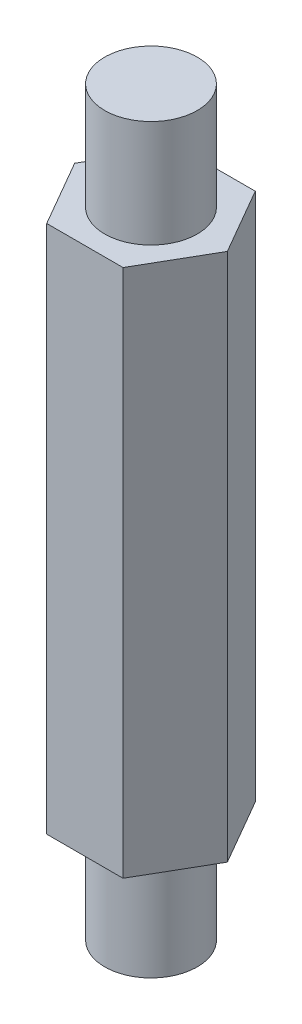
ISO-10303-21;
HEADER;
FILE_DESCRIPTION(('STEP AP214'),'2;1');
FILE_NAME('part.step','',(''),(''),'','','');
FILE_SCHEMA(('AUTOMOTIVE_DESIGN { 1 0 10303 214 1 1 1 1 }'));
ENDSEC;
DATA;
#1=APPLICATION_CONTEXT('core data for automotive mechanical design processes');
#2=APPLICATION_PROTOCOL_DEFINITION('international standard','automotive_design',2000,#1);
#3=PRODUCT_CONTEXT('',#1,'mechanical');
#4=PRODUCT('Part','Part','',(#3));
#5=PRODUCT_RELATED_PRODUCT_CATEGORY('part','',(#4));
#6=PRODUCT_DEFINITION_FORMATION('','',#4);
#7=PRODUCT_DEFINITION_CONTEXT('part definition',#1,'design');
#8=PRODUCT_DEFINITION('design','',#6,#7);
#9=PRODUCT_DEFINITION_SHAPE('','',#8);
#10=(LENGTH_UNIT() NAMED_UNIT(*) SI_UNIT(.MILLI.,.METRE.));
#11=(NAMED_UNIT(*) PLANE_ANGLE_UNIT() SI_UNIT($,.RADIAN.));
#12=(NAMED_UNIT(*) SI_UNIT($,.STERADIAN.) SOLID_ANGLE_UNIT());
#13=UNCERTAINTY_MEASURE_WITH_UNIT(LENGTH_MEASURE(1.E-05),#10,'distance_accuracy_value','');
#14=(GEOMETRIC_REPRESENTATION_CONTEXT(3) GLOBAL_UNCERTAINTY_ASSIGNED_CONTEXT((#13)) GLOBAL_UNIT_ASSIGNED_CONTEXT((#10,
#11,#12)) REPRESENTATION_CONTEXT('',''));
#15=CARTESIAN_POINT('',(0.,0.,0.));
#16=DIRECTION('',(0.,0.,1.));
#17=DIRECTION('',(1.,0.,0.));
#18=AXIS2_PLACEMENT_3D('',#15,#16,#17);
#19=CARTESIAN_POINT('',(-2.88675134594813,40.,-5.));
#20=DIRECTION('',(0.866025403784439,0.,0.5));
#21=DIRECTION('',(0.5,0.,-0.866025403784439));
#22=AXIS2_PLACEMENT_3D('',#19,#20,#21);
#23=PLANE('',#22);
#24=DIRECTION('',(-0.5,0.,0.866025403784439));
#25=VECTOR('',#24,1.);
#26=CARTESIAN_POINT('',(-2.88675134594813,0.,-5.));
#27=LINE('',#26,#25);
#28=CARTESIAN_POINT('',(-2.88675134594813,0.,-5.));
#29=VERTEX_POINT('',#28);
#30=CARTESIAN_POINT('',(-5.77350269189626,0.,0.));
#31=VERTEX_POINT('',#30);
#32=EDGE_CURVE('E135',#29,#31,#27,.T.);
#33=ORIENTED_EDGE('',*,*,#32,.T.);
#34=DIRECTION('',(0.,-1.,0.));
#35=VECTOR('',#34,1.);
#36=CARTESIAN_POINT('',(-5.77350269189626,40.,0.));
#37=LINE('',#36,#35);
#38=CARTESIAN_POINT('',(-5.77350269189626,40.,0.));
#39=VERTEX_POINT('',#38);
#40=EDGE_CURVE('E46',#39,#31,#37,.T.);
#41=ORIENTED_EDGE('',*,*,#40,.F.);
#42=DIRECTION('',(-0.5,0.,0.866025403784439));
#43=VECTOR('',#42,1.);
#44=CARTESIAN_POINT('',(-2.88675134594813,40.,-5.));
#45=LINE('',#44,#43);
#46=CARTESIAN_POINT('',(-2.88675134594813,40.,-5.));
#47=VERTEX_POINT('',#46);
#48=EDGE_CURVE('E152',#47,#39,#45,.T.);
#49=ORIENTED_EDGE('',*,*,#48,.F.);
#50=DIRECTION('',(0.,-1.,0.));
#51=VECTOR('',#50,1.);
#52=CARTESIAN_POINT('',(-2.88675134594813,40.,-5.));
#53=LINE('',#52,#51);
#54=EDGE_CURVE('E131',#47,#29,#53,.T.);
#55=ORIENTED_EDGE('',*,*,#54,.T.);
#56=EDGE_LOOP('',(#33,#41,#49,#55));
#57=FACE_BOUND('',#56,.T.);
#58=ADVANCED_FACE('F43',(#57),#23,.F.);
#59=CARTESIAN_POINT('',(-5.77350269189626,40.,0.));
#60=DIRECTION('',(0.866025403784439,0.,-0.5));
#61=DIRECTION('',(-0.5,0.,-0.866025403784439));
#62=AXIS2_PLACEMENT_3D('',#59,#60,#61);
#63=PLANE('',#62);
#64=DIRECTION('',(0.5,0.,0.866025403784439));
#65=VECTOR('',#64,1.);
#66=CARTESIAN_POINT('',(-5.77350269189626,0.,0.));
#67=LINE('',#66,#65);
#68=CARTESIAN_POINT('',(-2.88675134594813,0.,5.));
#69=VERTEX_POINT('',#68);
#70=EDGE_CURVE('E139',#31,#69,#67,.T.);
#71=ORIENTED_EDGE('',*,*,#70,.T.);
#72=DIRECTION('',(0.,-1.,0.));
#73=VECTOR('',#72,1.);
#74=CARTESIAN_POINT('',(-2.88675134594813,40.,5.));
#75=LINE('',#74,#73);
#76=CARTESIAN_POINT('',(-2.88675134594813,40.,5.));
#77=VERTEX_POINT('',#76);
#78=EDGE_CURVE('E158',#77,#69,#75,.T.);
#79=ORIENTED_EDGE('',*,*,#78,.F.);
#80=DIRECTION('',(0.5,0.,0.866025403784439));
#81=VECTOR('',#80,1.);
#82=CARTESIAN_POINT('',(-5.77350269189626,40.,0.));
#83=LINE('',#82,#81);
#84=EDGE_CURVE('E100',#39,#77,#83,.T.);
#85=ORIENTED_EDGE('',*,*,#84,.F.);
#86=ORIENTED_EDGE('',*,*,#40,.T.);
#87=EDGE_LOOP('',(#71,#79,#85,#86));
#88=FACE_BOUND('',#87,.T.);
#89=ADVANCED_FACE('F212',(#88),#63,.F.);
#90=CARTESIAN_POINT('',(-2.88675134594813,40.,5.));
#91=DIRECTION('',(0.,0.,-1.));
#92=DIRECTION('',(-1.,0.,0.));
#93=AXIS2_PLACEMENT_3D('',#90,#91,#92);
#94=PLANE('',#93);
#95=DIRECTION('',(1.,0.,0.));
#96=VECTOR('',#95,1.);
#97=CARTESIAN_POINT('',(-2.88675134594813,0.,5.));
#98=LINE('',#97,#96);
#99=CARTESIAN_POINT('',(2.88675134594813,0.,5.));
#100=VERTEX_POINT('',#99);
#101=EDGE_CURVE('E143',#69,#100,#98,.T.);
#102=ORIENTED_EDGE('',*,*,#101,.T.);
#103=DIRECTION('',(0.,-1.,0.));
#104=VECTOR('',#103,1.);
#105=CARTESIAN_POINT('',(2.88675134594813,40.,5.));
#106=LINE('',#105,#104);
#107=CARTESIAN_POINT('',(2.88675134594813,40.,5.));
#108=VERTEX_POINT('',#107);
#109=EDGE_CURVE('E124',#108,#100,#106,.T.);
#110=ORIENTED_EDGE('',*,*,#109,.F.);
#111=DIRECTION('',(1.,0.,0.));
#112=VECTOR('',#111,1.);
#113=CARTESIAN_POINT('',(-2.88675134594813,40.,5.));
#114=LINE('',#113,#112);
#115=EDGE_CURVE('E113',#77,#108,#114,.T.);
#116=ORIENTED_EDGE('',*,*,#115,.F.);
#117=ORIENTED_EDGE('',*,*,#78,.T.);
#118=EDGE_LOOP('',(#102,#110,#116,#117));
#119=FACE_BOUND('',#118,.T.);
#120=ADVANCED_FACE('F216',(#119),#94,.F.);
#121=CARTESIAN_POINT('',(2.88675134594813,40.,5.));
#122=DIRECTION('',(-0.866025403784439,0.,-0.5));
#123=DIRECTION('',(-0.5,0.,0.866025403784439));
#124=AXIS2_PLACEMENT_3D('',#121,#122,#123);
#125=PLANE('',#124);
#126=DIRECTION('',(0.5,0.,-0.866025403784439));
#127=VECTOR('',#126,1.);
#128=CARTESIAN_POINT('',(2.88675134594813,0.,5.));
#129=LINE('',#128,#127);
#130=CARTESIAN_POINT('',(5.77350269189626,0.,0.));
#131=VERTEX_POINT('',#130);
#132=EDGE_CURVE('E122',#100,#131,#129,.T.);
#133=ORIENTED_EDGE('',*,*,#132,.T.);
#134=DIRECTION('',(0.,-1.,0.));
#135=VECTOR('',#134,1.);
#136=CARTESIAN_POINT('',(5.77350269189626,40.,0.));
#137=LINE('',#136,#135);
#138=CARTESIAN_POINT('',(5.77350269189626,40.,0.));
#139=VERTEX_POINT('',#138);
#140=EDGE_CURVE('E119',#139,#131,#137,.T.);
#141=ORIENTED_EDGE('',*,*,#140,.F.);
#142=DIRECTION('',(0.5,0.,-0.866025403784439));
#143=VECTOR('',#142,1.);
#144=CARTESIAN_POINT('',(2.88675134594813,40.,5.));
#145=LINE('',#144,#143);
#146=EDGE_CURVE('E107',#108,#139,#145,.T.);
#147=ORIENTED_EDGE('',*,*,#146,.F.);
#148=ORIENTED_EDGE('',*,*,#109,.T.);
#149=EDGE_LOOP('',(#133,#141,#147,#148));
#150=FACE_BOUND('',#149,.T.);
#151=ADVANCED_FACE('F120',(#150),#125,.F.);
#152=CARTESIAN_POINT('',(5.77350269189626,40.,0.));
#153=DIRECTION('',(-0.866025403784439,0.,0.5));
#154=DIRECTION('',(0.5,0.,0.866025403784439));
#155=AXIS2_PLACEMENT_3D('',#152,#153,#154);
#156=PLANE('',#155);
#157=DIRECTION('',(-0.5,0.,-0.866025403784439));
#158=VECTOR('',#157,1.);
#159=CARTESIAN_POINT('',(5.77350269189626,0.,0.));
#160=LINE('',#159,#158);
#161=CARTESIAN_POINT('',(2.88675134594813,0.,-5.));
#162=VERTEX_POINT('',#161);
#163=EDGE_CURVE('E85',#131,#162,#160,.T.);
#164=ORIENTED_EDGE('',*,*,#163,.T.);
#165=DIRECTION('',(0.,-1.,0.));
#166=VECTOR('',#165,1.);
#167=CARTESIAN_POINT('',(2.88675134594813,40.,-5.));
#168=LINE('',#167,#166);
#169=CARTESIAN_POINT('',(2.88675134594813,40.,-5.));
#170=VERTEX_POINT('',#169);
#171=EDGE_CURVE('E125',#170,#162,#168,.T.);
#172=ORIENTED_EDGE('',*,*,#171,.F.);
#173=DIRECTION('',(-0.5,0.,-0.866025403784439));
#174=VECTOR('',#173,1.);
#175=CARTESIAN_POINT('',(5.77350269189626,40.,0.));
#176=LINE('',#175,#174);
#177=EDGE_CURVE('E111',#139,#170,#176,.T.);
#178=ORIENTED_EDGE('',*,*,#177,.F.);
#179=ORIENTED_EDGE('',*,*,#140,.T.);
#180=EDGE_LOOP('',(#164,#172,#178,#179));
#181=FACE_BOUND('',#180,.T.);
#182=ADVANCED_FACE('F127',(#181),#156,.F.);
#183=CARTESIAN_POINT('',(2.88675134594813,40.,-5.));
#184=DIRECTION('',(0.,0.,1.));
#185=DIRECTION('',(1.,0.,0.));
#186=AXIS2_PLACEMENT_3D('',#183,#184,#185);
#187=PLANE('',#186);
#188=DIRECTION('',(-1.,0.,0.));
#189=VECTOR('',#188,1.);
#190=CARTESIAN_POINT('',(2.88675134594813,0.,-5.));
#191=LINE('',#190,#189);
#192=EDGE_CURVE('E91',#162,#29,#191,.T.);
#193=ORIENTED_EDGE('',*,*,#192,.T.);
#194=ORIENTED_EDGE('',*,*,#54,.F.);
#195=DIRECTION('',(-1.,0.,0.));
#196=VECTOR('',#195,1.);
#197=CARTESIAN_POINT('',(2.88675134594813,40.,-5.));
#198=LINE('',#197,#196);
#199=EDGE_CURVE('E62',#170,#47,#198,.T.);
#200=ORIENTED_EDGE('',*,*,#199,.F.);
#201=ORIENTED_EDGE('',*,*,#171,.T.);
#202=EDGE_LOOP('',(#193,#194,#200,#201));
#203=FACE_BOUND('',#202,.T.);
#204=ADVANCED_FACE('F201',(#203),#187,.F.);
#205=CARTESIAN_POINT('',(0.,40.,0.));
#206=DIRECTION('',(0.,1.,0.));
#207=DIRECTION('',(0.,0.,1.));
#208=AXIS2_PLACEMENT_3D('',#205,#206,#207);
#209=PLANE('',#208);
#210=CARTESIAN_POINT('',(0.,40.,0.));
#211=DIRECTION('',(0.,1.,0.));
#212=DIRECTION('',(0.,0.,1.));
#213=AXIS2_PLACEMENT_3D('',#210,#211,#212);
#214=CIRCLE('',#213,3.5);
#215=CARTESIAN_POINT('',(0.,40.,3.5));
#216=VERTEX_POINT('',#215);
#217=EDGE_CURVE('E53',#216,#216,#214,.T.);
#218=ORIENTED_EDGE('',*,*,#217,.F.);
#219=EDGE_LOOP('',(#218));
#220=FACE_BOUND('',#219,.T.);
#221=ORIENTED_EDGE('',*,*,#48,.T.);
#222=ORIENTED_EDGE('',*,*,#84,.T.);
#223=ORIENTED_EDGE('',*,*,#115,.T.);
#224=ORIENTED_EDGE('',*,*,#146,.T.);
#225=ORIENTED_EDGE('',*,*,#177,.T.);
#226=ORIENTED_EDGE('',*,*,#199,.T.);
#227=EDGE_LOOP('',(#221,#222,#223,#224,#225,#226));
#228=FACE_BOUND('',#227,.T.);
#229=ADVANCED_FACE('F109',(#220,#228),#209,.T.);
#230=CARTESIAN_POINT('',(0.,0.,0.));
#231=DIRECTION('',(0.,1.,0.));
#232=DIRECTION('',(0.,0.,1.));
#233=AXIS2_PLACEMENT_3D('',#230,#231,#232);
#234=PLANE('',#233);
#235=CARTESIAN_POINT('',(0.,0.,0.));
#236=DIRECTION('',(0.,-1.,0.));
#237=DIRECTION('',(0.,0.,-1.));
#238=AXIS2_PLACEMENT_3D('',#235,#236,#237);
#239=CIRCLE('',#238,3.5);
#240=CARTESIAN_POINT('',(0.,0.,-3.5));
#241=VERTEX_POINT('',#240);
#242=EDGE_CURVE('E11',#241,#241,#239,.T.);
#243=ORIENTED_EDGE('',*,*,#242,.F.);
#244=EDGE_LOOP('',(#243));
#245=FACE_BOUND('',#244,.T.);
#246=ORIENTED_EDGE('',*,*,#32,.F.);
#247=ORIENTED_EDGE('',*,*,#192,.F.);
#248=ORIENTED_EDGE('',*,*,#163,.F.);
#249=ORIENTED_EDGE('',*,*,#132,.F.);
#250=ORIENTED_EDGE('',*,*,#101,.F.);
#251=ORIENTED_EDGE('',*,*,#70,.F.);
#252=EDGE_LOOP('',(#246,#247,#248,#249,#250,#251));
#253=FACE_BOUND('',#252,.T.);
#254=ADVANCED_FACE('F193',(#245,#253),#234,.F.);
#255=CARTESIAN_POINT('',(0.,48.0916054709663,0.));
#256=DIRECTION('',(0.,-1.,0.));
#257=DIRECTION('',(0.,0.,-1.));
#258=AXIS2_PLACEMENT_3D('',#255,#256,#257);
#259=CYLINDRICAL_SURFACE('',#258,3.5);
#260=CARTESIAN_POINT('',(0.,48.0916054709663,0.));
#261=DIRECTION('',(0.,1.,0.));
#262=DIRECTION('',(0.,0.,1.));
#263=AXIS2_PLACEMENT_3D('',#260,#261,#262);
#264=CIRCLE('',#263,3.5);
#265=CARTESIAN_POINT('',(0.,48.0916054709663,3.5));
#266=VERTEX_POINT('',#265);
#267=EDGE_CURVE('E140',#266,#266,#264,.T.);
#268=ORIENTED_EDGE('',*,*,#267,.F.);
#269=EDGE_LOOP('',(#268));
#270=FACE_BOUND('',#269,.T.);
#271=ORIENTED_EDGE('',*,*,#217,.T.);
#272=EDGE_LOOP('',(#271));
#273=FACE_BOUND('',#272,.T.);
#274=ADVANCED_FACE('F196',(#270,#273),#259,.T.);
#275=CARTESIAN_POINT('',(0.,48.0916054709663,0.));
#276=DIRECTION('',(0.,1.,0.));
#277=DIRECTION('',(0.,0.,1.));
#278=AXIS2_PLACEMENT_3D('',#275,#276,#277);
#279=PLANE('',#278);
#280=ORIENTED_EDGE('',*,*,#267,.T.);
#281=EDGE_LOOP('',(#280));
#282=FACE_BOUND('',#281,.T.);
#283=ADVANCED_FACE('F189',(#282),#279,.T.);
#284=CARTESIAN_POINT('',(0.,-8.,0.));
#285=DIRECTION('',(0.,1.,0.));
#286=DIRECTION('',(0.,0.,1.));
#287=AXIS2_PLACEMENT_3D('',#284,#285,#286);
#288=CYLINDRICAL_SURFACE('',#287,3.5);
#289=CARTESIAN_POINT('',(0.,-8.,0.));
#290=DIRECTION('',(0.,-1.,0.));
#291=DIRECTION('',(0.,0.,-1.));
#292=AXIS2_PLACEMENT_3D('',#289,#290,#291);
#293=CIRCLE('',#292,3.5);
#294=CARTESIAN_POINT('',(0.,-8.,-3.5));
#295=VERTEX_POINT('',#294);
#296=EDGE_CURVE('E179',#295,#295,#293,.T.);
#297=ORIENTED_EDGE('',*,*,#296,.F.);
#298=EDGE_LOOP('',(#297));
#299=FACE_BOUND('',#298,.T.);
#300=ORIENTED_EDGE('',*,*,#242,.T.);
#301=EDGE_LOOP('',(#300));
#302=FACE_BOUND('',#301,.T.);
#303=ADVANCED_FACE('F186',(#299,#302),#288,.T.);
#304=CARTESIAN_POINT('',(0.,-8.,0.));
#305=DIRECTION('',(0.,-1.,0.));
#306=DIRECTION('',(0.,0.,-1.));
#307=AXIS2_PLACEMENT_3D('',#304,#305,#306);
#308=PLANE('',#307);
#309=ORIENTED_EDGE('',*,*,#296,.T.);
#310=EDGE_LOOP('',(#309));
#311=FACE_BOUND('',#310,.T.);
#312=ADVANCED_FACE('F184',(#311),#308,.T.);
#313=CLOSED_SHELL('',(#58,#89,#120,#151,#182,#204,#229,#254,#274,#283,#303,#312));
#314=MANIFOLD_SOLID_BREP('B2',#313);
#315=ADVANCED_BREP_SHAPE_REPRESENTATION('',(#18,#314),#14);
#316=SHAPE_DEFINITION_REPRESENTATION(#9,#315);
ENDSEC;
END-ISO-10303-21;
